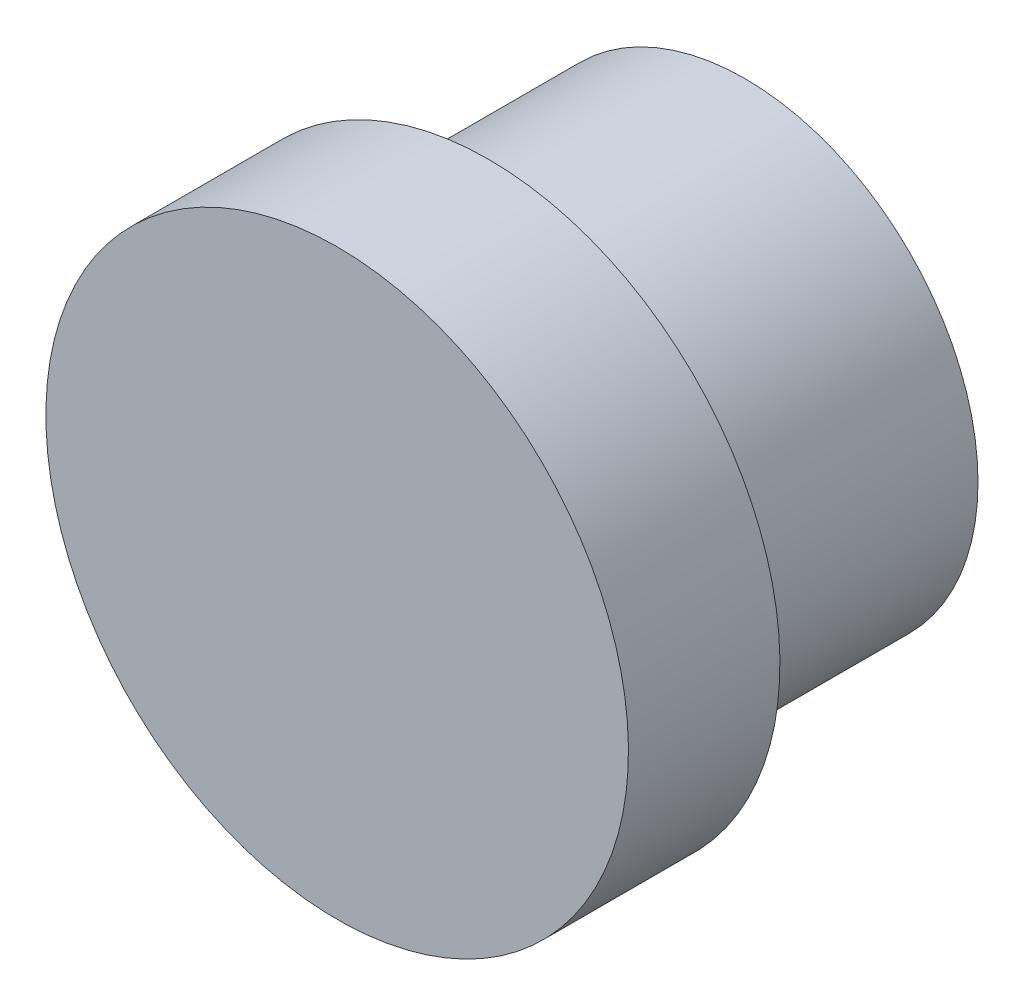
ISO-10303-21;
HEADER;
FILE_DESCRIPTION(('STEP AP214'),'2;1');
FILE_NAME('part.step','',(''),(''),'','','');
FILE_SCHEMA(('AUTOMOTIVE_DESIGN { 1 0 10303 214 1 1 1 1 }'));
ENDSEC;
DATA;
#1=APPLICATION_CONTEXT('core data for automotive mechanical design processes');
#2=APPLICATION_PROTOCOL_DEFINITION('international standard','automotive_design',2000,#1);
#3=PRODUCT_CONTEXT('',#1,'mechanical');
#4=PRODUCT('Part','Part','',(#3));
#5=PRODUCT_RELATED_PRODUCT_CATEGORY('part','',(#4));
#6=PRODUCT_DEFINITION_FORMATION('','',#4);
#7=PRODUCT_DEFINITION_CONTEXT('part definition',#1,'design');
#8=PRODUCT_DEFINITION('design','',#6,#7);
#9=PRODUCT_DEFINITION_SHAPE('','',#8);
#10=(LENGTH_UNIT() NAMED_UNIT(*) SI_UNIT(.MILLI.,.METRE.));
#11=(NAMED_UNIT(*) PLANE_ANGLE_UNIT() SI_UNIT($,.RADIAN.));
#12=(NAMED_UNIT(*) SI_UNIT($,.STERADIAN.) SOLID_ANGLE_UNIT());
#13=UNCERTAINTY_MEASURE_WITH_UNIT(LENGTH_MEASURE(1.E-05),#10,'distance_accuracy_value','');
#14=(GEOMETRIC_REPRESENTATION_CONTEXT(3) GLOBAL_UNCERTAINTY_ASSIGNED_CONTEXT((#13)) GLOBAL_UNIT_ASSIGNED_CONTEXT((#10,
#11,#12)) REPRESENTATION_CONTEXT('',''));
#15=CARTESIAN_POINT('',(0.,0.,0.));
#16=DIRECTION('',(0.,0.,1.));
#17=DIRECTION('',(1.,0.,0.));
#18=AXIS2_PLACEMENT_3D('',#15,#16,#17);
#19=CARTESIAN_POINT('',(0.686373767410355,96.6001412667392,115.610489149859));
#20=DIRECTION('',(0.,0.,-1.));
#21=DIRECTION('',(0.,-1.,0.));
#22=AXIS2_PLACEMENT_3D('',#19,#20,#21);
#23=PLANE('',#22);
#24=CARTESIAN_POINT('',(0.686373767410355,96.6001412667392,115.610489149859));
#25=DIRECTION('',(0.,0.,1.));
#26=DIRECTION('',(0.,-1.,0.));
#27=AXIS2_PLACEMENT_3D('',#24,#25,#26);
#28=CIRCLE('',#27,2.);
#29=CARTESIAN_POINT('',(0.686373767410355,94.6001412667392,115.610489149859));
#30=VERTEX_POINT('',#29);
#31=EDGE_CURVE('E11',#30,#30,#28,.T.);
#32=ORIENTED_EDGE('',*,*,#31,.F.);
#33=EDGE_LOOP('',(#32));
#34=FACE_BOUND('',#33,.T.);
#35=ADVANCED_FACE('F43',(#34),#23,.T.);
#36=CARTESIAN_POINT('',(0.686373767410355,96.6001412667392,115.610489149859));
#37=DIRECTION('',(0.,0.,1.));
#38=DIRECTION('',(0.866025403784439,-0.5,0.));
#39=AXIS2_PLACEMENT_3D('',#36,#37,#38);
#40=CYLINDRICAL_SURFACE('',#39,2.);
#41=CARTESIAN_POINT('',(0.686373767410355,96.6001412667392,117.810489149859));
#42=DIRECTION('',(0.,0.,-1.));
#43=DIRECTION('',(0.,1.,0.));
#44=AXIS2_PLACEMENT_3D('',#41,#42,#43);
#45=CIRCLE('',#44,2.);
#46=CARTESIAN_POINT('',(0.686373767410355,98.6001412667392,117.810489149859));
#47=VERTEX_POINT('',#46);
#48=EDGE_CURVE('E50',#47,#47,#45,.T.);
#49=ORIENTED_EDGE('',*,*,#48,.T.);
#50=EDGE_LOOP('',(#49));
#51=FACE_BOUND('',#50,.T.);
#52=ORIENTED_EDGE('',*,*,#31,.T.);
#53=EDGE_LOOP('',(#52));
#54=FACE_BOUND('',#53,.T.);
#55=ADVANCED_FACE('F78',(#51,#54),#40,.T.);
#56=CARTESIAN_POINT('',(0.686373767410355,96.6001412667392,117.810489149859));
#57=DIRECTION('',(0.,0.,1.));
#58=DIRECTION('',(1.,0.,0.));
#59=AXIS2_PLACEMENT_3D('',#56,#57,#58);
#60=PLANE('',#59);
#61=CARTESIAN_POINT('',(0.686373767410355,96.6001412667392,117.810489149859));
#62=DIRECTION('',(0.,0.,1.));
#63=DIRECTION('',(0.,1.,0.));
#64=AXIS2_PLACEMENT_3D('',#61,#62,#63);
#65=CIRCLE('',#64,2.5);
#66=CARTESIAN_POINT('',(0.686373767410355,99.1001412667392,117.810489149859));
#67=VERTEX_POINT('',#66);
#68=EDGE_CURVE('E68',#67,#67,#65,.T.);
#69=ORIENTED_EDGE('',*,*,#68,.F.);
#70=EDGE_LOOP('',(#69));
#71=FACE_BOUND('',#70,.T.);
#72=ORIENTED_EDGE('',*,*,#48,.F.);
#73=EDGE_LOOP('',(#72));
#74=FACE_BOUND('',#73,.T.);
#75=ADVANCED_FACE('F75',(#71,#74),#60,.F.);
#76=CARTESIAN_POINT('',(0.686373767410355,96.6001412667392,115.610489149859));
#77=DIRECTION('',(0.,0.,1.));
#78=DIRECTION('',(0.866025403784439,-0.5,0.));
#79=AXIS2_PLACEMENT_3D('',#76,#77,#78);
#80=CYLINDRICAL_SURFACE('',#79,2.5);
#81=CARTESIAN_POINT('',(0.686373767410355,96.6001412667392,119.110489149859));
#82=DIRECTION('',(0.,0.,1.));
#83=DIRECTION('',(-0.866025403784439,0.5,0.));
#84=AXIS2_PLACEMENT_3D('',#81,#82,#83);
#85=CIRCLE('',#84,2.5);
#86=CARTESIAN_POINT('',(-1.47868974205074,97.8501412667392,119.110489149859));
#87=VERTEX_POINT('',#86);
#88=EDGE_CURVE('E65',#87,#87,#85,.T.);
#89=ORIENTED_EDGE('',*,*,#88,.F.);
#90=EDGE_LOOP('',(#89));
#91=FACE_BOUND('',#90,.T.);
#92=ORIENTED_EDGE('',*,*,#68,.T.);
#93=EDGE_LOOP('',(#92));
#94=FACE_BOUND('',#93,.T.);
#95=ADVANCED_FACE('F73',(#91,#94),#80,.T.);
#96=CARTESIAN_POINT('',(0.686373767410355,96.6001412667392,119.110489149859));
#97=DIRECTION('',(0.,0.,-1.));
#98=DIRECTION('',(0.,-1.,0.));
#99=AXIS2_PLACEMENT_3D('',#96,#97,#98);
#100=PLANE('',#99);
#101=ORIENTED_EDGE('',*,*,#88,.T.);
#102=EDGE_LOOP('',(#101));
#103=FACE_BOUND('',#102,.T.);
#104=ADVANCED_FACE('F66',(#103),#100,.F.);
#105=CLOSED_SHELL('',(#35,#55,#75,#95,#104));
#106=MANIFOLD_SOLID_BREP('B2',#105);
#107=ADVANCED_BREP_SHAPE_REPRESENTATION('',(#18,#106),#14);
#108=SHAPE_DEFINITION_REPRESENTATION(#9,#107);
ENDSEC;
END-ISO-10303-21;
